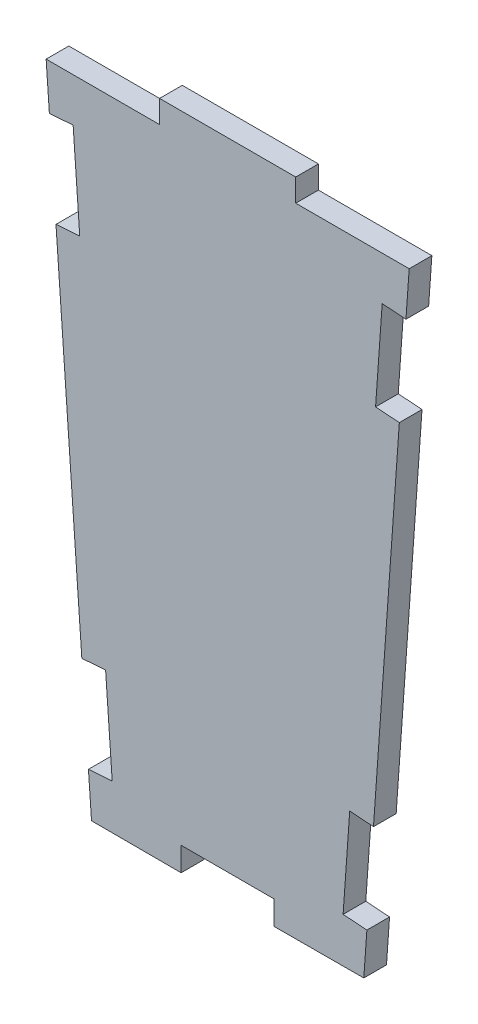
ISO-10303-21;
HEADER;
FILE_DESCRIPTION(('STEP AP214'),'2;1');
FILE_NAME('part.step','',(''),(''),'','','');
FILE_SCHEMA(('AUTOMOTIVE_DESIGN { 1 0 10303 214 1 1 1 1 }'));
ENDSEC;
DATA;
#1=APPLICATION_CONTEXT('core data for automotive mechanical design processes');
#2=APPLICATION_PROTOCOL_DEFINITION('international standard','automotive_design',2000,#1);
#3=PRODUCT_CONTEXT('',#1,'mechanical');
#4=PRODUCT('Part','Part','',(#3));
#5=PRODUCT_RELATED_PRODUCT_CATEGORY('part','',(#4));
#6=PRODUCT_DEFINITION_FORMATION('','',#4);
#7=PRODUCT_DEFINITION_CONTEXT('part definition',#1,'design');
#8=PRODUCT_DEFINITION('design','',#6,#7);
#9=PRODUCT_DEFINITION_SHAPE('','',#8);
#10=(LENGTH_UNIT() NAMED_UNIT(*) SI_UNIT(.MILLI.,.METRE.));
#11=(NAMED_UNIT(*) PLANE_ANGLE_UNIT() SI_UNIT($,.RADIAN.));
#12=(NAMED_UNIT(*) SI_UNIT($,.STERADIAN.) SOLID_ANGLE_UNIT());
#13=UNCERTAINTY_MEASURE_WITH_UNIT(LENGTH_MEASURE(1.E-05),#10,'distance_accuracy_value','');
#14=(GEOMETRIC_REPRESENTATION_CONTEXT(3) GLOBAL_UNCERTAINTY_ASSIGNED_CONTEXT((#13)) GLOBAL_UNIT_ASSIGNED_CONTEXT((#10,
#11,#12)) REPRESENTATION_CONTEXT('',''));
#15=CARTESIAN_POINT('',(0.,0.,0.));
#16=DIRECTION('',(0.,0.,1.));
#17=DIRECTION('',(1.,0.,0.));
#18=AXIS2_PLACEMENT_3D('',#15,#16,#17);
#19=CARTESIAN_POINT('',(363.747024457994,-153.683245156876,2.5));
#20=DIRECTION('',(0.0023210919259634,0.999997306262508,0.));
#21=DIRECTION('',(-0.999997306262508,0.0023210919259634,0.));
#22=AXIS2_PLACEMENT_3D('',#19,#20,#21);
#23=PLANE('',#22);
#24=DIRECTION('',(0.999997306262508,-0.0023210919259634,0.));
#25=VECTOR('',#24,1.);
#26=CARTESIAN_POINT('',(363.747024457994,-153.683245156876,-2.5));
#27=LINE('',#26,#25);
#28=CARTESIAN_POINT('',(363.747024457994,-153.683245156876,-2.5));
#29=VERTEX_POINT('',#28);
#30=CARTESIAN_POINT('',(383.496918055507,-153.729086598929,-2.5));
#31=VERTEX_POINT('',#30);
#32=EDGE_CURVE('E249',#29,#31,#27,.T.);
#33=ORIENTED_EDGE('',*,*,#32,.T.);
#34=DIRECTION('',(0.,0.,-1.));
#35=VECTOR('',#34,1.);
#36=CARTESIAN_POINT('',(383.496918055507,-153.729086598929,2.5));
#37=LINE('',#36,#35);
#38=CARTESIAN_POINT('',(383.496918055507,-153.729086598929,2.5));
#39=VERTEX_POINT('',#38);
#40=EDGE_CURVE('E11',#39,#31,#37,.T.);
#41=ORIENTED_EDGE('',*,*,#40,.F.);
#42=DIRECTION('',(0.999997306262508,-0.0023210919259634,0.));
#43=VECTOR('',#42,1.);
#44=CARTESIAN_POINT('',(363.747024457994,-153.683245156876,2.5));
#45=LINE('',#44,#43);
#46=CARTESIAN_POINT('',(363.747024457994,-153.683245156876,2.5));
#47=VERTEX_POINT('',#46);
#48=EDGE_CURVE('E303',#47,#39,#45,.T.);
#49=ORIENTED_EDGE('',*,*,#48,.F.);
#50=DIRECTION('',(0.,0.,-1.));
#51=VECTOR('',#50,1.);
#52=CARTESIAN_POINT('',(363.747024457994,-153.683245156876,2.5));
#53=LINE('',#52,#51);
#54=EDGE_CURVE('E245',#47,#29,#53,.T.);
#55=ORIENTED_EDGE('',*,*,#54,.T.);
#56=EDGE_LOOP('',(#33,#41,#49,#55));
#57=FACE_BOUND('',#56,.T.);
#58=ADVANCED_FACE('F33',(#57),#23,.F.);
#59=CARTESIAN_POINT('',(383.496918055507,-153.729086598929,2.5));
#60=DIRECTION('',(-0.999999999794576,2.02693821584738E-05,0.));
#61=DIRECTION('',(-2.02693821584738E-05,-0.999999999794576,0.));
#62=AXIS2_PLACEMENT_3D('',#59,#60,#61);
#63=PLANE('',#62);
#64=DIRECTION('',(2.02693821584738E-05,0.999999999794576,0.));
#65=VECTOR('',#64,1.);
#66=CARTESIAN_POINT('',(383.496918055507,-153.729086598929,-2.5));
#67=LINE('',#66,#65);
#68=CARTESIAN_POINT('',(383.497024457996,-148.479667120444,-2.5));
#69=VERTEX_POINT('',#68);
#70=EDGE_CURVE('E252',#31,#69,#67,.T.);
#71=ORIENTED_EDGE('',*,*,#70,.T.);
#72=DIRECTION('',(0.,0.,-1.));
#73=VECTOR('',#72,1.);
#74=CARTESIAN_POINT('',(383.497024457996,-148.479667120444,2.5));
#75=LINE('',#74,#73);
#76=CARTESIAN_POINT('',(383.497024457996,-148.479667120444,2.5));
#77=VERTEX_POINT('',#76);
#78=EDGE_CURVE('E41',#77,#69,#75,.T.);
#79=ORIENTED_EDGE('',*,*,#78,.F.);
#80=DIRECTION('',(2.02693821584738E-05,0.999999999794576,0.));
#81=VECTOR('',#80,1.);
#82=CARTESIAN_POINT('',(383.496918055507,-153.729086598929,2.5));
#83=LINE('',#82,#81);
#84=EDGE_CURVE('E152',#39,#77,#83,.T.);
#85=ORIENTED_EDGE('',*,*,#84,.F.);
#86=ORIENTED_EDGE('',*,*,#40,.T.);
#87=EDGE_LOOP('',(#71,#79,#85,#86));
#88=FACE_BOUND('',#87,.T.);
#89=ADVANCED_FACE('F461',(#88),#63,.F.);
#90=CARTESIAN_POINT('',(383.497024457996,-148.479667120444,2.5));
#91=DIRECTION('',(0.,1.,0.));
#92=DIRECTION('',(0.,0.,1.));
#93=AXIS2_PLACEMENT_3D('',#90,#91,#92);
#94=PLANE('',#93);
#95=DIRECTION('',(1.,0.,0.));
#96=VECTOR('',#95,1.);
#97=CARTESIAN_POINT('',(383.497024457996,-148.479667120444,-2.5));
#98=LINE('',#97,#96);
#99=CARTESIAN_POINT('',(403.996445189324,-148.479667120444,-2.5));
#100=VERTEX_POINT('',#99);
#101=EDGE_CURVE('E254',#69,#100,#98,.T.);
#102=ORIENTED_EDGE('',*,*,#101,.T.);
#103=DIRECTION('',(0.,0.,-1.));
#104=VECTOR('',#103,1.);
#105=CARTESIAN_POINT('',(403.996445189324,-148.479667120444,2.5));
#106=LINE('',#105,#104);
#107=CARTESIAN_POINT('',(403.996445189324,-148.479667120444,2.5));
#108=VERTEX_POINT('',#107);
#109=EDGE_CURVE('E370',#108,#100,#106,.T.);
#110=ORIENTED_EDGE('',*,*,#109,.F.);
#111=DIRECTION('',(1.,0.,0.));
#112=VECTOR('',#111,1.);
#113=CARTESIAN_POINT('',(383.497024457996,-148.479667120444,2.5));
#114=LINE('',#113,#112);
#115=EDGE_CURVE('E378',#77,#108,#114,.T.);
#116=ORIENTED_EDGE('',*,*,#115,.F.);
#117=ORIENTED_EDGE('',*,*,#78,.T.);
#118=EDGE_LOOP('',(#102,#110,#116,#117));
#119=FACE_BOUND('',#118,.T.);
#120=ADVANCED_FACE('F376',(#119),#94,.F.);
#121=CARTESIAN_POINT('',(403.996445189324,-148.479667120444,2.5));
#122=DIRECTION('',(0.999999991469407,0.000130618472053474,0.));
#123=DIRECTION('',(-0.000130618472053474,0.999999991469407,0.));
#124=AXIS2_PLACEMENT_3D('',#121,#122,#123);
#125=PLANE('',#124);
#126=DIRECTION('',(0.000130618472053474,-0.999999991469407,0.));
#127=VECTOR('',#126,1.);
#128=CARTESIAN_POINT('',(403.996445189324,-148.479667120444,-2.5));
#129=LINE('',#128,#127);
#130=CARTESIAN_POINT('',(403.997130860481,-153.729086598929,-2.5));
#131=VERTEX_POINT('',#130);
#132=EDGE_CURVE('E256',#100,#131,#129,.T.);
#133=ORIENTED_EDGE('',*,*,#132,.T.);
#134=DIRECTION('',(0.,0.,-1.));
#135=VECTOR('',#134,1.);
#136=CARTESIAN_POINT('',(403.997130860481,-153.729086598929,2.5));
#137=LINE('',#136,#135);
#138=CARTESIAN_POINT('',(403.997130860481,-153.729086598929,2.5));
#139=VERTEX_POINT('',#138);
#140=EDGE_CURVE('E367',#139,#131,#137,.T.);
#141=ORIENTED_EDGE('',*,*,#140,.F.);
#142=DIRECTION('',(0.000130618472053474,-0.999999991469407,0.));
#143=VECTOR('',#142,1.);
#144=CARTESIAN_POINT('',(403.996445189324,-148.479667120444,2.5));
#145=LINE('',#144,#143);
#146=EDGE_CURVE('E396',#108,#139,#145,.T.);
#147=ORIENTED_EDGE('',*,*,#146,.F.);
#148=ORIENTED_EDGE('',*,*,#109,.T.);
#149=EDGE_LOOP('',(#133,#141,#147,#148));
#150=FACE_BOUND('',#149,.T.);
#151=ADVANCED_FACE('F387',(#150),#125,.F.);
#152=CARTESIAN_POINT('',(423.747024457994,-153.683245156876,2.5));
#153=DIRECTION('',(-0.0023210919259634,0.999997306262508,0.));
#154=DIRECTION('',(-0.999997306262508,-0.0023210919259634,0.));
#155=AXIS2_PLACEMENT_3D('',#152,#153,#154);
#156=PLANE('',#155);
#157=DIRECTION('',(0.999997306262508,0.0023210919259634,0.));
#158=VECTOR('',#157,1.);
#159=CARTESIAN_POINT('',(423.747024457994,-153.683245156876,-2.5));
#160=LINE('',#159,#158);
#161=CARTESIAN_POINT('',(423.747024457994,-153.683245156876,-2.5));
#162=VERTEX_POINT('',#161);
#163=EDGE_CURVE('E258',#131,#162,#160,.T.);
#164=ORIENTED_EDGE('',*,*,#163,.T.);
#165=DIRECTION('',(0.,0.,-1.));
#166=VECTOR('',#165,1.);
#167=CARTESIAN_POINT('',(423.747024457994,-153.683245156876,2.5));
#168=LINE('',#167,#166);
#169=CARTESIAN_POINT('',(423.747024457994,-153.683245156876,2.5));
#170=VERTEX_POINT('',#169);
#171=EDGE_CURVE('E364',#170,#162,#168,.T.);
#172=ORIENTED_EDGE('',*,*,#171,.F.);
#173=DIRECTION('',(0.999997306262508,0.0023210919259634,0.));
#174=VECTOR('',#173,1.);
#175=CARTESIAN_POINT('',(423.747024457994,-153.683245156876,2.5));
#176=LINE('',#175,#174);
#177=EDGE_CURVE('E393',#139,#170,#176,.T.);
#178=ORIENTED_EDGE('',*,*,#177,.F.);
#179=ORIENTED_EDGE('',*,*,#140,.T.);
#180=EDGE_LOOP('',(#164,#172,#178,#179));
#181=FACE_BOUND('',#180,.T.);
#182=ADVANCED_FACE('F391',(#181),#156,.F.);
#183=CARTESIAN_POINT('',(424.423262183472,-144.191572442052,2.5));
#184=DIRECTION('',(-0.997471669801728,0.0710652372327852,0.));
#185=DIRECTION('',(-0.0710652372327852,-0.997471669801728,0.));
#186=AXIS2_PLACEMENT_3D('',#183,#184,#185);
#187=PLANE('',#186);
#188=DIRECTION('',(0.0710652372327852,0.997471669801728,0.));
#189=VECTOR('',#188,1.);
#190=CARTESIAN_POINT('',(424.423262183472,-144.191572442052,-2.5));
#191=LINE('',#190,#189);
#192=CARTESIAN_POINT('',(424.423262183472,-144.191572442052,-2.5));
#193=VERTEX_POINT('',#192);
#194=EDGE_CURVE('E260',#162,#193,#191,.T.);
#195=ORIENTED_EDGE('',*,*,#194,.T.);
#196=DIRECTION('',(0.,0.,-1.));
#197=VECTOR('',#196,1.);
#198=CARTESIAN_POINT('',(424.423262183472,-144.191572442052,2.5));
#199=LINE('',#198,#197);
#200=CARTESIAN_POINT('',(424.423262183472,-144.191572442052,2.5));
#201=VERTEX_POINT('',#200);
#202=EDGE_CURVE('E361',#201,#193,#199,.T.);
#203=ORIENTED_EDGE('',*,*,#202,.F.);
#204=DIRECTION('',(0.0710652372327852,0.997471669801728,0.));
#205=VECTOR('',#204,1.);
#206=CARTESIAN_POINT('',(424.423262183472,-144.191572442052,2.5));
#207=LINE('',#206,#205);
#208=EDGE_CURVE('E395',#170,#201,#207,.T.);
#209=ORIENTED_EDGE('',*,*,#208,.F.);
#210=ORIENTED_EDGE('',*,*,#171,.T.);
#211=EDGE_LOOP('',(#195,#203,#209,#210));
#212=FACE_BOUND('',#211,.T.);
#213=ADVANCED_FACE('F474',(#212),#187,.F.);
#214=CARTESIAN_POINT('',(419.186535917013,-143.818479946579,2.5));
#215=DIRECTION('',(-0.0710652372329773,-0.997471669801715,0.));
#216=DIRECTION('',(0.997471669801715,-0.0710652372329773,0.));
#217=AXIS2_PLACEMENT_3D('',#214,#215,#216);
#218=PLANE('',#217);
#219=DIRECTION('',(-0.997471669801715,0.0710652372329773,0.));
#220=VECTOR('',#219,1.);
#221=CARTESIAN_POINT('',(419.186535917013,-143.818479946579,-2.5));
#222=LINE('',#221,#220);
#223=CARTESIAN_POINT('',(419.186535917013,-143.818479946579,-2.5));
#224=VERTEX_POINT('',#223);
#225=EDGE_CURVE('E262',#193,#224,#222,.T.);
#226=ORIENTED_EDGE('',*,*,#225,.T.);
#227=DIRECTION('',(0.,0.,-1.));
#228=VECTOR('',#227,1.);
#229=CARTESIAN_POINT('',(419.186535917013,-143.818479946579,2.5));
#230=LINE('',#229,#228);
#231=CARTESIAN_POINT('',(419.186535917013,-143.818479946579,2.5));
#232=VERTEX_POINT('',#231);
#233=EDGE_CURVE('E358',#232,#224,#230,.T.);
#234=ORIENTED_EDGE('',*,*,#233,.F.);
#235=DIRECTION('',(-0.997471669801715,0.0710652372329773,0.));
#236=VECTOR('',#235,1.);
#237=CARTESIAN_POINT('',(419.186535917013,-143.818479946579,2.5));
#238=LINE('',#237,#236);
#239=EDGE_CURVE('E398',#201,#232,#238,.T.);
#240=ORIENTED_EDGE('',*,*,#239,.F.);
#241=ORIENTED_EDGE('',*,*,#202,.T.);
#242=EDGE_LOOP('',(#226,#234,#240,#241));
#243=FACE_BOUND('',#242,.T.);
#244=ADVANCED_FACE('F477',(#243),#218,.F.);
#245=CARTESIAN_POINT('',(420.64337328029,-123.370310715643,2.5));
#246=DIRECTION('',(-0.997471669801713,0.0710652372330059,0.));
#247=DIRECTION('',(-0.0710652372330059,-0.997471669801713,0.));
#248=AXIS2_PLACEMENT_3D('',#245,#246,#247);
#249=PLANE('',#248);
#250=DIRECTION('',(0.0710652372330059,0.997471669801713,0.));
#251=VECTOR('',#250,1.);
#252=CARTESIAN_POINT('',(420.64337328029,-123.370310715643,-2.5));
#253=LINE('',#252,#251);
#254=CARTESIAN_POINT('',(420.64337328029,-123.370310715643,-2.5));
#255=VERTEX_POINT('',#254);
#256=EDGE_CURVE('E264',#224,#255,#253,.T.);
#257=ORIENTED_EDGE('',*,*,#256,.T.);
#258=DIRECTION('',(0.,0.,-1.));
#259=VECTOR('',#258,1.);
#260=CARTESIAN_POINT('',(420.64337328029,-123.370310715643,2.5));
#261=LINE('',#260,#259);
#262=CARTESIAN_POINT('',(420.64337328029,-123.370310715643,2.5));
#263=VERTEX_POINT('',#262);
#264=EDGE_CURVE('E355',#263,#255,#261,.T.);
#265=ORIENTED_EDGE('',*,*,#264,.F.);
#266=DIRECTION('',(0.0710652372330059,0.997471669801713,0.));
#267=VECTOR('',#266,1.);
#268=CARTESIAN_POINT('',(420.64337328029,-123.370310715643,2.5));
#269=LINE('',#268,#267);
#270=EDGE_CURVE('E404',#232,#263,#269,.T.);
#271=ORIENTED_EDGE('',*,*,#270,.F.);
#272=ORIENTED_EDGE('',*,*,#233,.T.);
#273=EDGE_LOOP('',(#257,#265,#271,#272));
#274=FACE_BOUND('',#273,.T.);
#275=ADVANCED_FACE('F481',(#274),#249,.F.);
#276=CARTESIAN_POINT('',(425.880099546749,-123.743403211116,2.5));
#277=DIRECTION('',(0.0710652372329108,0.997471669801719,0.));
#278=DIRECTION('',(-0.997471669801719,0.0710652372329108,0.));
#279=AXIS2_PLACEMENT_3D('',#276,#277,#278);
#280=PLANE('',#279);
#281=DIRECTION('',(0.997471669801719,-0.0710652372329108,0.));
#282=VECTOR('',#281,1.);
#283=CARTESIAN_POINT('',(425.880099546749,-123.743403211116,-2.5));
#284=LINE('',#283,#282);
#285=CARTESIAN_POINT('',(425.880099546749,-123.743403211116,-2.5));
#286=VERTEX_POINT('',#285);
#287=EDGE_CURVE('E266',#255,#286,#284,.T.);
#288=ORIENTED_EDGE('',*,*,#287,.T.);
#289=DIRECTION('',(0.,0.,-1.));
#290=VECTOR('',#289,1.);
#291=CARTESIAN_POINT('',(425.880099546749,-123.743403211116,2.5));
#292=LINE('',#291,#290);
#293=CARTESIAN_POINT('',(425.880099546749,-123.743403211116,2.5));
#294=VERTEX_POINT('',#293);
#295=EDGE_CURVE('E352',#294,#286,#292,.T.);
#296=ORIENTED_EDGE('',*,*,#295,.F.);
#297=DIRECTION('',(0.997471669801719,-0.0710652372329108,0.));
#298=VECTOR('',#297,1.);
#299=CARTESIAN_POINT('',(425.880099546749,-123.743403211116,2.5));
#300=LINE('',#299,#298);
#301=EDGE_CURVE('E406',#263,#294,#300,.T.);
#302=ORIENTED_EDGE('',*,*,#301,.F.);
#303=ORIENTED_EDGE('',*,*,#264,.T.);
#304=EDGE_LOOP('',(#288,#296,#302,#303));
#305=FACE_BOUND('',#304,.T.);
#306=ADVANCED_FACE('F485',(#305),#280,.F.);
#307=CARTESIAN_POINT('',(431.577507118818,-43.7745905295464,2.5));
#308=DIRECTION('',(-0.997471669801717,0.0710652372329441,0.));
#309=DIRECTION('',(-0.0710652372329441,-0.997471669801717,0.));
#310=AXIS2_PLACEMENT_3D('',#307,#308,#309);
#311=PLANE('',#310);
#312=DIRECTION('',(0.0710652372329441,0.997471669801717,0.));
#313=VECTOR('',#312,1.);
#314=CARTESIAN_POINT('',(431.577507118818,-43.7745905295464,-2.5));
#315=LINE('',#314,#313);
#316=CARTESIAN_POINT('',(431.577507118818,-43.7745905295464,-2.5));
#317=VERTEX_POINT('',#316);
#318=EDGE_CURVE('E268',#286,#317,#315,.T.);
#319=ORIENTED_EDGE('',*,*,#318,.T.);
#320=DIRECTION('',(0.,0.,-1.));
#321=VECTOR('',#320,1.);
#322=CARTESIAN_POINT('',(431.577507118818,-43.7745905295464,2.5));
#323=LINE('',#322,#321);
#324=CARTESIAN_POINT('',(431.577507118818,-43.7745905295464,2.5));
#325=VERTEX_POINT('',#324);
#326=EDGE_CURVE('E349',#325,#317,#323,.T.);
#327=ORIENTED_EDGE('',*,*,#326,.F.);
#328=DIRECTION('',(0.0710652372329441,0.997471669801717,0.));
#329=VECTOR('',#328,1.);
#330=CARTESIAN_POINT('',(431.577507118818,-43.7745905295464,2.5));
#331=LINE('',#330,#329);
#332=EDGE_CURVE('E408',#294,#325,#331,.T.);
#333=ORIENTED_EDGE('',*,*,#332,.F.);
#334=ORIENTED_EDGE('',*,*,#295,.T.);
#335=EDGE_LOOP('',(#319,#327,#333,#334));
#336=FACE_BOUND('',#335,.T.);
#337=ADVANCED_FACE('F489',(#336),#311,.F.);
#338=CARTESIAN_POINT('',(426.340780852359,-43.4014980340735,2.5));
#339=DIRECTION('',(-0.0710652372329437,-0.997471669801717,0.));
#340=DIRECTION('',(0.997471669801717,-0.0710652372329437,0.));
#341=AXIS2_PLACEMENT_3D('',#338,#339,#340);
#342=PLANE('',#341);
#343=DIRECTION('',(-0.997471669801717,0.0710652372329437,0.));
#344=VECTOR('',#343,1.);
#345=CARTESIAN_POINT('',(426.340780852359,-43.4014980340735,-2.5));
#346=LINE('',#345,#344);
#347=CARTESIAN_POINT('',(426.340780852359,-43.4014980340735,-2.5));
#348=VERTEX_POINT('',#347);
#349=EDGE_CURVE('E270',#317,#348,#346,.T.);
#350=ORIENTED_EDGE('',*,*,#349,.T.);
#351=DIRECTION('',(0.,0.,-1.));
#352=VECTOR('',#351,1.);
#353=CARTESIAN_POINT('',(426.340780852359,-43.4014980340735,2.5));
#354=LINE('',#353,#352);
#355=CARTESIAN_POINT('',(426.340780852359,-43.4014980340735,2.5));
#356=VERTEX_POINT('',#355);
#357=EDGE_CURVE('E346',#356,#348,#354,.T.);
#358=ORIENTED_EDGE('',*,*,#357,.F.);
#359=DIRECTION('',(-0.997471669801717,0.0710652372329437,0.));
#360=VECTOR('',#359,1.);
#361=CARTESIAN_POINT('',(426.340780852359,-43.4014980340735,2.5));
#362=LINE('',#361,#360);
#363=EDGE_CURVE('E410',#325,#356,#362,.T.);
#364=ORIENTED_EDGE('',*,*,#363,.F.);
#365=ORIENTED_EDGE('',*,*,#326,.T.);
#366=EDGE_LOOP('',(#350,#358,#364,#365));
#367=FACE_BOUND('',#366,.T.);
#368=ADVANCED_FACE('F493',(#367),#342,.F.);
#369=CARTESIAN_POINT('',(427.797618215636,-22.9533288031375,2.5));
#370=DIRECTION('',(-0.997471669801713,0.0710652372330053,0.));
#371=DIRECTION('',(-0.0710652372330053,-0.997471669801713,0.));
#372=AXIS2_PLACEMENT_3D('',#369,#370,#371);
#373=PLANE('',#372);
#374=DIRECTION('',(0.0710652372330053,0.997471669801713,0.));
#375=VECTOR('',#374,1.);
#376=CARTESIAN_POINT('',(427.797618215636,-22.9533288031375,-2.5));
#377=LINE('',#376,#375);
#378=CARTESIAN_POINT('',(427.797618215636,-22.9533288031375,-2.5));
#379=VERTEX_POINT('',#378);
#380=EDGE_CURVE('E272',#348,#379,#377,.T.);
#381=ORIENTED_EDGE('',*,*,#380,.T.);
#382=DIRECTION('',(0.,0.,-1.));
#383=VECTOR('',#382,1.);
#384=CARTESIAN_POINT('',(427.797618215636,-22.9533288031375,2.5));
#385=LINE('',#384,#383);
#386=CARTESIAN_POINT('',(427.797618215636,-22.9533288031375,2.5));
#387=VERTEX_POINT('',#386);
#388=EDGE_CURVE('E343',#387,#379,#385,.T.);
#389=ORIENTED_EDGE('',*,*,#388,.F.);
#390=DIRECTION('',(0.0710652372330053,0.997471669801713,0.));
#391=VECTOR('',#390,1.);
#392=CARTESIAN_POINT('',(427.797618215636,-22.9533288031375,2.5));
#393=LINE('',#392,#391);
#394=EDGE_CURVE('E412',#356,#387,#393,.T.);
#395=ORIENTED_EDGE('',*,*,#394,.F.);
#396=ORIENTED_EDGE('',*,*,#357,.T.);
#397=EDGE_LOOP('',(#381,#389,#395,#396));
#398=FACE_BOUND('',#397,.T.);
#399=ADVANCED_FACE('F497',(#398),#373,.F.);
#400=CARTESIAN_POINT('',(433.034344482094,-23.3264212986106,2.5));
#401=DIRECTION('',(0.0710652372329765,0.997471669801715,0.));
#402=DIRECTION('',(-0.997471669801715,0.0710652372329765,0.));
#403=AXIS2_PLACEMENT_3D('',#400,#401,#402);
#404=PLANE('',#403);
#405=DIRECTION('',(0.997471669801715,-0.0710652372329765,0.));
#406=VECTOR('',#405,1.);
#407=CARTESIAN_POINT('',(433.034344482094,-23.3264212986106,-2.5));
#408=LINE('',#407,#406);
#409=CARTESIAN_POINT('',(433.034344482094,-23.3264212986106,-2.5));
#410=VERTEX_POINT('',#409);
#411=EDGE_CURVE('E274',#379,#410,#408,.T.);
#412=ORIENTED_EDGE('',*,*,#411,.T.);
#413=DIRECTION('',(0.,0.,-1.));
#414=VECTOR('',#413,1.);
#415=CARTESIAN_POINT('',(433.034344482094,-23.3264212986106,2.5));
#416=LINE('',#415,#414);
#417=CARTESIAN_POINT('',(433.034344482094,-23.3264212986106,2.5));
#418=VERTEX_POINT('',#417);
#419=EDGE_CURVE('E340',#418,#410,#416,.T.);
#420=ORIENTED_EDGE('',*,*,#419,.F.);
#421=DIRECTION('',(0.997471669801715,-0.0710652372329765,0.));
#422=VECTOR('',#421,1.);
#423=CARTESIAN_POINT('',(433.034344482094,-23.3264212986106,2.5));
#424=LINE('',#423,#422);
#425=EDGE_CURVE('E414',#387,#418,#424,.T.);
#426=ORIENTED_EDGE('',*,*,#425,.F.);
#427=ORIENTED_EDGE('',*,*,#388,.T.);
#428=EDGE_LOOP('',(#412,#420,#426,#427));
#429=FACE_BOUND('',#428,.T.);
#430=ADVANCED_FACE('F501',(#429),#404,.F.);
#431=CARTESIAN_POINT('',(433.747024457995,-13.3232451568764,2.5));
#432=DIRECTION('',(-0.997471669801713,0.0710652372330026,0.));
#433=DIRECTION('',(-0.0710652372330026,-0.997471669801713,0.));
#434=AXIS2_PLACEMENT_3D('',#431,#432,#433);
#435=PLANE('',#434);
#436=DIRECTION('',(0.0710652372330026,0.997471669801713,0.));
#437=VECTOR('',#436,1.);
#438=CARTESIAN_POINT('',(433.747024457995,-13.3232451568764,-2.5));
#439=LINE('',#438,#437);
#440=CARTESIAN_POINT('',(433.747024457995,-13.3232451568764,-2.5));
#441=VERTEX_POINT('',#440);
#442=EDGE_CURVE('E276',#410,#441,#439,.T.);
#443=ORIENTED_EDGE('',*,*,#442,.T.);
#444=DIRECTION('',(0.,0.,-1.));
#445=VECTOR('',#444,1.);
#446=CARTESIAN_POINT('',(433.747024457995,-13.3232451568764,2.5));
#447=LINE('',#446,#445);
#448=CARTESIAN_POINT('',(433.747024457995,-13.3232451568764,2.5));
#449=VERTEX_POINT('',#448);
#450=EDGE_CURVE('E337',#449,#441,#447,.T.);
#451=ORIENTED_EDGE('',*,*,#450,.F.);
#452=DIRECTION('',(0.0710652372330026,0.997471669801713,0.));
#453=VECTOR('',#452,1.);
#454=CARTESIAN_POINT('',(433.747024457995,-13.3232451568764,2.5));
#455=LINE('',#454,#453);
#456=EDGE_CURVE('E416',#418,#449,#455,.T.);
#457=ORIENTED_EDGE('',*,*,#456,.F.);
#458=ORIENTED_EDGE('',*,*,#419,.T.);
#459=EDGE_LOOP('',(#443,#451,#457,#458));
#460=FACE_BOUND('',#459,.T.);
#461=ADVANCED_FACE('F505',(#460),#435,.F.);
#462=CARTESIAN_POINT('',(408.747024457995,-13.3232451568764,2.5));
#463=DIRECTION('',(0.,-1.,0.));
#464=DIRECTION('',(0.,0.,-1.));
#465=AXIS2_PLACEMENT_3D('',#462,#463,#464);
#466=PLANE('',#465);
#467=DIRECTION('',(-1.,0.,0.));
#468=VECTOR('',#467,1.);
#469=CARTESIAN_POINT('',(408.747024457995,-13.3232451568764,-2.5));
#470=LINE('',#469,#468);
#471=CARTESIAN_POINT('',(408.747024457995,-13.3232451568764,-2.5));
#472=VERTEX_POINT('',#471);
#473=EDGE_CURVE('E278',#441,#472,#470,.T.);
#474=ORIENTED_EDGE('',*,*,#473,.T.);
#475=DIRECTION('',(0.,0.,-1.));
#476=VECTOR('',#475,1.);
#477=CARTESIAN_POINT('',(408.747024457995,-13.3232451568764,2.5));
#478=LINE('',#477,#476);
#479=CARTESIAN_POINT('',(408.747024457995,-13.3232451568764,2.5));
#480=VERTEX_POINT('',#479);
#481=EDGE_CURVE('E334',#480,#472,#478,.T.);
#482=ORIENTED_EDGE('',*,*,#481,.F.);
#483=DIRECTION('',(-1.,0.,0.));
#484=VECTOR('',#483,1.);
#485=CARTESIAN_POINT('',(408.747024457995,-13.3232451568764,2.5));
#486=LINE('',#485,#484);
#487=EDGE_CURVE('E418',#449,#480,#486,.T.);
#488=ORIENTED_EDGE('',*,*,#487,.F.);
#489=ORIENTED_EDGE('',*,*,#450,.T.);
#490=EDGE_LOOP('',(#474,#482,#488,#489));
#491=FACE_BOUND('',#490,.T.);
#492=ADVANCED_FACE('F509',(#491),#466,.F.);
#493=CARTESIAN_POINT('',(408.747024457995,-8.32324515687648,2.5));
#494=DIRECTION('',(-1.,0.,0.));
#495=DIRECTION('',(0.,0.,1.));
#496=AXIS2_PLACEMENT_3D('',#493,#494,#495);
#497=PLANE('',#496);
#498=DIRECTION('',(0.,1.,0.));
#499=VECTOR('',#498,1.);
#500=CARTESIAN_POINT('',(408.747024457995,-8.32324515687648,-2.5));
#501=LINE('',#500,#499);
#502=CARTESIAN_POINT('',(408.747024457995,-8.32324515687648,-2.5));
#503=VERTEX_POINT('',#502);
#504=EDGE_CURVE('E280',#472,#503,#501,.T.);
#505=ORIENTED_EDGE('',*,*,#504,.T.);
#506=DIRECTION('',(0.,0.,-1.));
#507=VECTOR('',#506,1.);
#508=CARTESIAN_POINT('',(408.747024457995,-8.32324515687648,2.5));
#509=LINE('',#508,#507);
#510=CARTESIAN_POINT('',(408.747024457995,-8.32324515687648,2.5));
#511=VERTEX_POINT('',#510);
#512=EDGE_CURVE('E331',#511,#503,#509,.T.);
#513=ORIENTED_EDGE('',*,*,#512,.F.);
#514=DIRECTION('',(0.,1.,0.));
#515=VECTOR('',#514,1.);
#516=CARTESIAN_POINT('',(408.747024457995,-8.32324515687648,2.5));
#517=LINE('',#516,#515);
#518=EDGE_CURVE('E420',#480,#511,#517,.T.);
#519=ORIENTED_EDGE('',*,*,#518,.F.);
#520=ORIENTED_EDGE('',*,*,#481,.T.);
#521=EDGE_LOOP('',(#505,#513,#519,#520));
#522=FACE_BOUND('',#521,.T.);
#523=ADVANCED_FACE('F513',(#522),#497,.F.);
#524=CARTESIAN_POINT('',(378.747024457993,-8.32324515687648,2.5));
#525=DIRECTION('',(0.,-1.,0.));
#526=DIRECTION('',(0.,0.,-1.));
#527=AXIS2_PLACEMENT_3D('',#524,#525,#526);
#528=PLANE('',#527);
#529=DIRECTION('',(-1.,0.,0.));
#530=VECTOR('',#529,1.);
#531=CARTESIAN_POINT('',(378.747024457993,-8.32324515687648,-2.5));
#532=LINE('',#531,#530);
#533=CARTESIAN_POINT('',(378.747024457993,-8.32324515687648,-2.5));
#534=VERTEX_POINT('',#533);
#535=EDGE_CURVE('E282',#503,#534,#532,.T.);
#536=ORIENTED_EDGE('',*,*,#535,.T.);
#537=DIRECTION('',(0.,0.,-1.));
#538=VECTOR('',#537,1.);
#539=CARTESIAN_POINT('',(378.747024457993,-8.32324515687648,2.5));
#540=LINE('',#539,#538);
#541=CARTESIAN_POINT('',(378.747024457993,-8.32324515687648,2.5));
#542=VERTEX_POINT('',#541);
#543=EDGE_CURVE('E328',#542,#534,#540,.T.);
#544=ORIENTED_EDGE('',*,*,#543,.F.);
#545=DIRECTION('',(-1.,0.,0.));
#546=VECTOR('',#545,1.);
#547=CARTESIAN_POINT('',(378.747024457993,-8.32324515687648,2.5));
#548=LINE('',#547,#546);
#549=EDGE_CURVE('E422',#511,#542,#548,.T.);
#550=ORIENTED_EDGE('',*,*,#549,.F.);
#551=ORIENTED_EDGE('',*,*,#512,.T.);
#552=EDGE_LOOP('',(#536,#544,#550,#551));
#553=FACE_BOUND('',#552,.T.);
#554=ADVANCED_FACE('F517',(#553),#528,.F.);
#555=CARTESIAN_POINT('',(378.747024457993,-8.32324515687648,2.5));
#556=DIRECTION('',(1.,0.,0.));
#557=DIRECTION('',(0.,0.,-1.));
#558=AXIS2_PLACEMENT_3D('',#555,#556,#557);
#559=PLANE('',#558);
#560=DIRECTION('',(0.,-1.,0.));
#561=VECTOR('',#560,1.);
#562=CARTESIAN_POINT('',(378.747024457993,-8.32324515687648,-2.5));
#563=LINE('',#562,#561);
#564=CARTESIAN_POINT('',(378.747024457993,-13.3232451568764,-2.5));
#565=VERTEX_POINT('',#564);
#566=EDGE_CURVE('E284',#534,#565,#563,.T.);
#567=ORIENTED_EDGE('',*,*,#566,.T.);
#568=DIRECTION('',(0.,0.,-1.));
#569=VECTOR('',#568,1.);
#570=CARTESIAN_POINT('',(378.747024457993,-13.3232451568764,2.5));
#571=LINE('',#570,#569);
#572=CARTESIAN_POINT('',(378.747024457993,-13.3232451568764,2.5));
#573=VERTEX_POINT('',#572);
#574=EDGE_CURVE('E325',#573,#565,#571,.T.);
#575=ORIENTED_EDGE('',*,*,#574,.F.);
#576=DIRECTION('',(0.,-1.,0.));
#577=VECTOR('',#576,1.);
#578=CARTESIAN_POINT('',(378.747024457993,-8.32324515687648,2.5));
#579=LINE('',#578,#577);
#580=EDGE_CURVE('E424',#542,#573,#579,.T.);
#581=ORIENTED_EDGE('',*,*,#580,.F.);
#582=ORIENTED_EDGE('',*,*,#543,.T.);
#583=EDGE_LOOP('',(#567,#575,#581,#582));
#584=FACE_BOUND('',#583,.T.);
#585=ADVANCED_FACE('F521',(#584),#559,.F.);
#586=CARTESIAN_POINT('',(378.747024457993,-13.3232451568764,2.5));
#587=DIRECTION('',(0.,-1.,0.));
#588=DIRECTION('',(0.,0.,-1.));
#589=AXIS2_PLACEMENT_3D('',#586,#587,#588);
#590=PLANE('',#589);
#591=DIRECTION('',(-1.,0.,0.));
#592=VECTOR('',#591,1.);
#593=CARTESIAN_POINT('',(378.747024457993,-13.3232451568764,-2.5));
#594=LINE('',#593,#592);
#595=CARTESIAN_POINT('',(353.747024457993,-13.3232451568764,-2.5));
#596=VERTEX_POINT('',#595);
#597=EDGE_CURVE('E286',#565,#596,#594,.T.);
#598=ORIENTED_EDGE('',*,*,#597,.T.);
#599=DIRECTION('',(0.,0.,-1.));
#600=VECTOR('',#599,1.);
#601=CARTESIAN_POINT('',(353.747024457993,-13.3232451568764,2.5));
#602=LINE('',#601,#600);
#603=CARTESIAN_POINT('',(353.747024457993,-13.3232451568764,2.5));
#604=VERTEX_POINT('',#603);
#605=EDGE_CURVE('E322',#604,#596,#602,.T.);
#606=ORIENTED_EDGE('',*,*,#605,.F.);
#607=DIRECTION('',(-1.,0.,0.));
#608=VECTOR('',#607,1.);
#609=CARTESIAN_POINT('',(378.747024457993,-13.3232451568764,2.5));
#610=LINE('',#609,#608);
#611=EDGE_CURVE('E426',#573,#604,#610,.T.);
#612=ORIENTED_EDGE('',*,*,#611,.F.);
#613=ORIENTED_EDGE('',*,*,#574,.T.);
#614=EDGE_LOOP('',(#598,#606,#612,#613));
#615=FACE_BOUND('',#614,.T.);
#616=ADVANCED_FACE('F525',(#615),#590,.F.);
#617=CARTESIAN_POINT('',(353.747024457993,-13.3232451568764,2.5));
#618=DIRECTION('',(0.997471669801712,0.0710652372330136,0.));
#619=DIRECTION('',(-0.0710652372330136,0.997471669801712,0.));
#620=AXIS2_PLACEMENT_3D('',#617,#618,#619);
#621=PLANE('',#620);
#622=DIRECTION('',(0.0710652372330136,-0.997471669801712,0.));
#623=VECTOR('',#622,1.);
#624=CARTESIAN_POINT('',(353.747024457993,-13.3232451568764,-2.5));
#625=LINE('',#624,#623);
#626=CARTESIAN_POINT('',(354.459704433894,-23.3264212986106,-2.5));
#627=VERTEX_POINT('',#626);
#628=EDGE_CURVE('E288',#596,#627,#625,.T.);
#629=ORIENTED_EDGE('',*,*,#628,.T.);
#630=DIRECTION('',(0.,0.,-1.));
#631=VECTOR('',#630,1.);
#632=CARTESIAN_POINT('',(354.459704433894,-23.3264212986106,2.5));
#633=LINE('',#632,#631);
#634=CARTESIAN_POINT('',(354.459704433894,-23.3264212986106,2.5));
#635=VERTEX_POINT('',#634);
#636=EDGE_CURVE('E319',#635,#627,#633,.T.);
#637=ORIENTED_EDGE('',*,*,#636,.F.);
#638=DIRECTION('',(0.0710652372330136,-0.997471669801712,0.));
#639=VECTOR('',#638,1.);
#640=CARTESIAN_POINT('',(353.747024457993,-13.3232451568764,2.5));
#641=LINE('',#640,#639);
#642=EDGE_CURVE('E428',#604,#635,#641,.T.);
#643=ORIENTED_EDGE('',*,*,#642,.F.);
#644=ORIENTED_EDGE('',*,*,#605,.T.);
#645=EDGE_LOOP('',(#629,#637,#643,#644));
#646=FACE_BOUND('',#645,.T.);
#647=ADVANCED_FACE('F529',(#646),#621,.F.);
#648=CARTESIAN_POINT('',(354.459704433894,-23.3264212986106,2.5));
#649=DIRECTION('',(-0.071065237232978,0.997471669801714,0.));
#650=DIRECTION('',(-0.997471669801715,-0.071065237232978,0.));
#651=AXIS2_PLACEMENT_3D('',#648,#649,#650);
#652=PLANE('',#651);
#653=DIRECTION('',(0.997471669801715,0.071065237232978,0.));
#654=VECTOR('',#653,1.);
#655=CARTESIAN_POINT('',(354.459704433894,-23.3264212986106,-2.5));
#656=LINE('',#655,#654);
#657=CARTESIAN_POINT('',(359.696430700352,-22.9533288031375,-2.5));
#658=VERTEX_POINT('',#657);
#659=EDGE_CURVE('E290',#627,#658,#656,.T.);
#660=ORIENTED_EDGE('',*,*,#659,.T.);
#661=DIRECTION('',(0.,0.,-1.));
#662=VECTOR('',#661,1.);
#663=CARTESIAN_POINT('',(359.696430700352,-22.9533288031375,2.5));
#664=LINE('',#663,#662);
#665=CARTESIAN_POINT('',(359.696430700352,-22.9533288031375,2.5));
#666=VERTEX_POINT('',#665);
#667=EDGE_CURVE('E316',#666,#658,#664,.T.);
#668=ORIENTED_EDGE('',*,*,#667,.F.);
#669=DIRECTION('',(0.997471669801715,0.071065237232978,0.));
#670=VECTOR('',#669,1.);
#671=CARTESIAN_POINT('',(354.459704433894,-23.3264212986106,2.5));
#672=LINE('',#671,#670);
#673=EDGE_CURVE('E430',#635,#666,#672,.T.);
#674=ORIENTED_EDGE('',*,*,#673,.F.);
#675=ORIENTED_EDGE('',*,*,#636,.T.);
#676=EDGE_LOOP('',(#660,#668,#674,#675));
#677=FACE_BOUND('',#676,.T.);
#678=ADVANCED_FACE('F533',(#677),#652,.F.);
#679=CARTESIAN_POINT('',(359.696430700352,-22.9533288031375,2.5));
#680=DIRECTION('',(0.997471669801713,0.0710652372330053,0.));
#681=DIRECTION('',(-0.0710652372330053,0.997471669801713,0.));
#682=AXIS2_PLACEMENT_3D('',#679,#680,#681);
#683=PLANE('',#682);
#684=DIRECTION('',(0.0710652372330053,-0.997471669801713,0.));
#685=VECTOR('',#684,1.);
#686=CARTESIAN_POINT('',(359.696430700352,-22.9533288031375,-2.5));
#687=LINE('',#686,#685);
#688=CARTESIAN_POINT('',(361.153268063629,-43.4014980340735,-2.5));
#689=VERTEX_POINT('',#688);
#690=EDGE_CURVE('E292',#658,#689,#687,.T.);
#691=ORIENTED_EDGE('',*,*,#690,.T.);
#692=DIRECTION('',(0.,0.,-1.));
#693=VECTOR('',#692,1.);
#694=CARTESIAN_POINT('',(361.153268063629,-43.4014980340735,2.5));
#695=LINE('',#694,#693);
#696=CARTESIAN_POINT('',(361.153268063629,-43.4014980340735,2.5));
#697=VERTEX_POINT('',#696);
#698=EDGE_CURVE('E313',#697,#689,#695,.T.);
#699=ORIENTED_EDGE('',*,*,#698,.F.);
#700=DIRECTION('',(0.0710652372330053,-0.997471669801713,0.));
#701=VECTOR('',#700,1.);
#702=CARTESIAN_POINT('',(359.696430700352,-22.9533288031375,2.5));
#703=LINE('',#702,#701);
#704=EDGE_CURVE('E432',#666,#697,#703,.T.);
#705=ORIENTED_EDGE('',*,*,#704,.F.);
#706=ORIENTED_EDGE('',*,*,#667,.T.);
#707=EDGE_LOOP('',(#691,#699,#705,#706));
#708=FACE_BOUND('',#707,.T.);
#709=ADVANCED_FACE('F537',(#708),#683,.F.);
#710=CARTESIAN_POINT('',(361.153268063629,-43.4014980340735,2.5));
#711=DIRECTION('',(0.0710652372329445,-0.997471669801717,0.));
#712=DIRECTION('',(0.997471669801717,0.0710652372329445,0.));
#713=AXIS2_PLACEMENT_3D('',#710,#711,#712);
#714=PLANE('',#713);
#715=DIRECTION('',(-0.997471669801717,-0.0710652372329444,0.));
#716=VECTOR('',#715,1.);
#717=CARTESIAN_POINT('',(361.153268063629,-43.4014980340735,-2.5));
#718=LINE('',#717,#716);
#719=CARTESIAN_POINT('',(355.91654179717,-43.7745905295464,-2.5));
#720=VERTEX_POINT('',#719);
#721=EDGE_CURVE('E294',#689,#720,#718,.T.);
#722=ORIENTED_EDGE('',*,*,#721,.T.);
#723=DIRECTION('',(0.,0.,-1.));
#724=VECTOR('',#723,1.);
#725=CARTESIAN_POINT('',(355.91654179717,-43.7745905295464,2.5));
#726=LINE('',#725,#724);
#727=CARTESIAN_POINT('',(355.91654179717,-43.7745905295464,2.5));
#728=VERTEX_POINT('',#727);
#729=EDGE_CURVE('E310',#728,#720,#726,.T.);
#730=ORIENTED_EDGE('',*,*,#729,.F.);
#731=DIRECTION('',(-0.997471669801717,-0.0710652372329444,0.));
#732=VECTOR('',#731,1.);
#733=CARTESIAN_POINT('',(361.153268063629,-43.4014980340735,2.5));
#734=LINE('',#733,#732);
#735=EDGE_CURVE('E434',#697,#728,#734,.T.);
#736=ORIENTED_EDGE('',*,*,#735,.F.);
#737=ORIENTED_EDGE('',*,*,#698,.T.);
#738=EDGE_LOOP('',(#722,#730,#736,#737));
#739=FACE_BOUND('',#738,.T.);
#740=ADVANCED_FACE('F541',(#739),#714,.F.);
#741=CARTESIAN_POINT('',(355.91654179717,-43.7745905295464,2.5));
#742=DIRECTION('',(0.997471669801717,0.0710652372329441,0.));
#743=DIRECTION('',(-0.0710652372329441,0.997471669801717,0.));
#744=AXIS2_PLACEMENT_3D('',#741,#742,#743);
#745=PLANE('',#744);
#746=DIRECTION('',(0.0710652372329441,-0.997471669801717,0.));
#747=VECTOR('',#746,1.);
#748=CARTESIAN_POINT('',(355.91654179717,-43.7745905295464,-2.5));
#749=LINE('',#748,#747);
#750=CARTESIAN_POINT('',(361.613949369239,-123.743403211116,-2.5));
#751=VERTEX_POINT('',#750);
#752=EDGE_CURVE('E296',#720,#751,#749,.T.);
#753=ORIENTED_EDGE('',*,*,#752,.T.);
#754=DIRECTION('',(0.,0.,-1.));
#755=VECTOR('',#754,1.);
#756=CARTESIAN_POINT('',(361.613949369239,-123.743403211116,2.5));
#757=LINE('',#756,#755);
#758=CARTESIAN_POINT('',(361.613949369239,-123.743403211116,2.5));
#759=VERTEX_POINT('',#758);
#760=EDGE_CURVE('E307',#759,#751,#757,.T.);
#761=ORIENTED_EDGE('',*,*,#760,.F.);
#762=DIRECTION('',(0.0710652372329441,-0.997471669801717,0.));
#763=VECTOR('',#762,1.);
#764=CARTESIAN_POINT('',(355.91654179717,-43.7745905295464,2.5));
#765=LINE('',#764,#763);
#766=EDGE_CURVE('E436',#728,#759,#765,.T.);
#767=ORIENTED_EDGE('',*,*,#766,.F.);
#768=ORIENTED_EDGE('',*,*,#729,.T.);
#769=EDGE_LOOP('',(#753,#761,#767,#768));
#770=FACE_BOUND('',#769,.T.);
#771=ADVANCED_FACE('F442',(#770),#745,.F.);
#772=CARTESIAN_POINT('',(361.613949369239,-123.743403211116,2.5));
#773=DIRECTION('',(-0.0710652372328726,0.997471669801722,0.));
#774=DIRECTION('',(-0.997471669801722,-0.0710652372328726,0.));
#775=AXIS2_PLACEMENT_3D('',#772,#773,#774);
#776=PLANE('',#775);
#777=DIRECTION('',(0.997471669801722,0.0710652372328726,0.));
#778=VECTOR('',#777,1.);
#779=CARTESIAN_POINT('',(361.613949369239,-123.743403211116,-2.5));
#780=LINE('',#779,#778);
#781=CARTESIAN_POINT('',(366.850675635701,-123.370310715643,-2.5));
#782=VERTEX_POINT('',#781);
#783=EDGE_CURVE('E298',#751,#782,#780,.T.);
#784=ORIENTED_EDGE('',*,*,#783,.T.);
#785=DIRECTION('',(0.,0.,-1.));
#786=VECTOR('',#785,1.);
#787=CARTESIAN_POINT('',(366.850675635701,-123.370310715643,2.5));
#788=LINE('',#787,#786);
#789=CARTESIAN_POINT('',(366.850675635701,-123.370310715643,2.5));
#790=VERTEX_POINT('',#789);
#791=EDGE_CURVE('E240',#790,#782,#788,.T.);
#792=ORIENTED_EDGE('',*,*,#791,.F.);
#793=DIRECTION('',(0.997471669801722,0.0710652372328726,0.));
#794=VECTOR('',#793,1.);
#795=CARTESIAN_POINT('',(361.613949369239,-123.743403211116,2.5));
#796=LINE('',#795,#794);
#797=EDGE_CURVE('E231',#759,#790,#796,.T.);
#798=ORIENTED_EDGE('',*,*,#797,.F.);
#799=ORIENTED_EDGE('',*,*,#760,.T.);
#800=EDGE_LOOP('',(#784,#792,#798,#799));
#801=FACE_BOUND('',#800,.T.);
#802=ADVANCED_FACE('F446',(#801),#776,.F.);
#803=CARTESIAN_POINT('',(366.850675635701,-123.370310715643,2.5));
#804=DIRECTION('',(0.997471669801722,0.0710652372328685,0.));
#805=DIRECTION('',(-0.0710652372328685,0.997471669801722,0.));
#806=AXIS2_PLACEMENT_3D('',#803,#804,#805);
#807=PLANE('',#806);
#808=DIRECTION('',(0.0710652372328685,-0.997471669801722,0.));
#809=VECTOR('',#808,1.);
#810=CARTESIAN_POINT('',(366.850675635701,-123.370310715643,-2.5));
#811=LINE('',#810,#809);
#812=CARTESIAN_POINT('',(368.307512998975,-143.818479946579,-2.5));
#813=VERTEX_POINT('',#812);
#814=EDGE_CURVE('E239',#782,#813,#811,.T.);
#815=ORIENTED_EDGE('',*,*,#814,.T.);
#816=DIRECTION('',(0.,0.,-1.));
#817=VECTOR('',#816,1.);
#818=CARTESIAN_POINT('',(368.307512998975,-143.818479946579,2.5));
#819=LINE('',#818,#817);
#820=CARTESIAN_POINT('',(368.307512998975,-143.818479946579,2.5));
#821=VERTEX_POINT('',#820);
#822=EDGE_CURVE('E236',#821,#813,#819,.T.);
#823=ORIENTED_EDGE('',*,*,#822,.F.);
#824=DIRECTION('',(0.0710652372328685,-0.997471669801722,0.));
#825=VECTOR('',#824,1.);
#826=CARTESIAN_POINT('',(366.850675635701,-123.370310715643,2.5));
#827=LINE('',#826,#825);
#828=EDGE_CURVE('E225',#790,#821,#827,.T.);
#829=ORIENTED_EDGE('',*,*,#828,.F.);
#830=ORIENTED_EDGE('',*,*,#791,.T.);
#831=EDGE_LOOP('',(#815,#823,#829,#830));
#832=FACE_BOUND('',#831,.T.);
#833=ADVANCED_FACE('F237',(#832),#807,.F.);
#834=CARTESIAN_POINT('',(368.307512998975,-143.818479946579,2.5));
#835=DIRECTION('',(0.0710652372329766,-0.997471669801715,0.));
#836=DIRECTION('',(0.997471669801715,0.0710652372329766,0.));
#837=AXIS2_PLACEMENT_3D('',#834,#835,#836);
#838=PLANE('',#837);
#839=DIRECTION('',(-0.997471669801715,-0.0710652372329766,0.));
#840=VECTOR('',#839,1.);
#841=CARTESIAN_POINT('',(368.307512998975,-143.818479946579,-2.5));
#842=LINE('',#841,#840);
#843=CARTESIAN_POINT('',(363.070786732516,-144.191572442052,-2.5));
#844=VERTEX_POINT('',#843);
#845=EDGE_CURVE('E138',#813,#844,#842,.T.);
#846=ORIENTED_EDGE('',*,*,#845,.T.);
#847=DIRECTION('',(0.,0.,-1.));
#848=VECTOR('',#847,1.);
#849=CARTESIAN_POINT('',(363.070786732516,-144.191572442052,2.5));
#850=LINE('',#849,#848);
#851=CARTESIAN_POINT('',(363.070786732516,-144.191572442052,2.5));
#852=VERTEX_POINT('',#851);
#853=EDGE_CURVE('E241',#852,#844,#850,.T.);
#854=ORIENTED_EDGE('',*,*,#853,.F.);
#855=DIRECTION('',(-0.997471669801715,-0.0710652372329766,0.));
#856=VECTOR('',#855,1.);
#857=CARTESIAN_POINT('',(368.307512998975,-143.818479946579,2.5));
#858=LINE('',#857,#856);
#859=EDGE_CURVE('E229',#821,#852,#858,.T.);
#860=ORIENTED_EDGE('',*,*,#859,.F.);
#861=ORIENTED_EDGE('',*,*,#822,.T.);
#862=EDGE_LOOP('',(#846,#854,#860,#861));
#863=FACE_BOUND('',#862,.T.);
#864=ADVANCED_FACE('F243',(#863),#838,.F.);
#865=CARTESIAN_POINT('',(363.070786732516,-144.191572442052,2.5));
#866=DIRECTION('',(0.997471669801728,0.071065237232791,0.));
#867=DIRECTION('',(-0.071065237232791,0.997471669801728,0.));
#868=AXIS2_PLACEMENT_3D('',#865,#866,#867);
#869=PLANE('',#868);
#870=DIRECTION('',(0.071065237232791,-0.997471669801728,0.));
#871=VECTOR('',#870,1.);
#872=CARTESIAN_POINT('',(363.070786732516,-144.191572442052,-2.5));
#873=LINE('',#872,#871);
#874=EDGE_CURVE('E144',#844,#29,#873,.T.);
#875=ORIENTED_EDGE('',*,*,#874,.T.);
#876=ORIENTED_EDGE('',*,*,#54,.F.);
#877=DIRECTION('',(0.071065237232791,-0.997471669801728,0.));
#878=VECTOR('',#877,1.);
#879=CARTESIAN_POINT('',(363.070786732516,-144.191572442052,2.5));
#880=LINE('',#879,#878);
#881=EDGE_CURVE('E49',#852,#47,#880,.T.);
#882=ORIENTED_EDGE('',*,*,#881,.F.);
#883=ORIENTED_EDGE('',*,*,#853,.T.);
#884=EDGE_LOOP('',(#875,#876,#882,#883));
#885=FACE_BOUND('',#884,.T.);
#886=ADVANCED_FACE('F450',(#885),#869,.F.);
#887=CARTESIAN_POINT('',(0.,0.,2.5));
#888=DIRECTION('',(0.,0.,1.));
#889=DIRECTION('',(1.,0.,0.));
#890=AXIS2_PLACEMENT_3D('',#887,#888,#889);
#891=PLANE('',#890);
#892=ORIENTED_EDGE('',*,*,#48,.T.);
#893=ORIENTED_EDGE('',*,*,#84,.T.);
#894=ORIENTED_EDGE('',*,*,#115,.T.);
#895=ORIENTED_EDGE('',*,*,#146,.T.);
#896=ORIENTED_EDGE('',*,*,#177,.T.);
#897=ORIENTED_EDGE('',*,*,#208,.T.);
#898=ORIENTED_EDGE('',*,*,#239,.T.);
#899=ORIENTED_EDGE('',*,*,#270,.T.);
#900=ORIENTED_EDGE('',*,*,#301,.T.);
#901=ORIENTED_EDGE('',*,*,#332,.T.);
#902=ORIENTED_EDGE('',*,*,#363,.T.);
#903=ORIENTED_EDGE('',*,*,#394,.T.);
#904=ORIENTED_EDGE('',*,*,#425,.T.);
#905=ORIENTED_EDGE('',*,*,#456,.T.);
#906=ORIENTED_EDGE('',*,*,#487,.T.);
#907=ORIENTED_EDGE('',*,*,#518,.T.);
#908=ORIENTED_EDGE('',*,*,#549,.T.);
#909=ORIENTED_EDGE('',*,*,#580,.T.);
#910=ORIENTED_EDGE('',*,*,#611,.T.);
#911=ORIENTED_EDGE('',*,*,#642,.T.);
#912=ORIENTED_EDGE('',*,*,#673,.T.);
#913=ORIENTED_EDGE('',*,*,#704,.T.);
#914=ORIENTED_EDGE('',*,*,#735,.T.);
#915=ORIENTED_EDGE('',*,*,#766,.T.);
#916=ORIENTED_EDGE('',*,*,#797,.T.);
#917=ORIENTED_EDGE('',*,*,#828,.T.);
#918=ORIENTED_EDGE('',*,*,#859,.T.);
#919=ORIENTED_EDGE('',*,*,#881,.T.);
#920=EDGE_LOOP('',(#892,#893,#894,#895,#896,#897,#898,#899,#900,#901,#902,#903,#904,#905,#906,
#907,#908,#909,#910,#911,#912,#913,#914,#915,#916,#917,#918,#919));
#921=FACE_BOUND('',#920,.T.);
#922=ADVANCED_FACE('F227',(#921),#891,.T.);
#923=CARTESIAN_POINT('',(0.,0.,-2.5));
#924=DIRECTION('',(0.,0.,1.));
#925=DIRECTION('',(1.,0.,0.));
#926=AXIS2_PLACEMENT_3D('',#923,#924,#925);
#927=PLANE('',#926);
#928=ORIENTED_EDGE('',*,*,#32,.F.);
#929=ORIENTED_EDGE('',*,*,#874,.F.);
#930=ORIENTED_EDGE('',*,*,#845,.F.);
#931=ORIENTED_EDGE('',*,*,#814,.F.);
#932=ORIENTED_EDGE('',*,*,#783,.F.);
#933=ORIENTED_EDGE('',*,*,#752,.F.);
#934=ORIENTED_EDGE('',*,*,#721,.F.);
#935=ORIENTED_EDGE('',*,*,#690,.F.);
#936=ORIENTED_EDGE('',*,*,#659,.F.);
#937=ORIENTED_EDGE('',*,*,#628,.F.);
#938=ORIENTED_EDGE('',*,*,#597,.F.);
#939=ORIENTED_EDGE('',*,*,#566,.F.);
#940=ORIENTED_EDGE('',*,*,#535,.F.);
#941=ORIENTED_EDGE('',*,*,#504,.F.);
#942=ORIENTED_EDGE('',*,*,#473,.F.);
#943=ORIENTED_EDGE('',*,*,#442,.F.);
#944=ORIENTED_EDGE('',*,*,#411,.F.);
#945=ORIENTED_EDGE('',*,*,#380,.F.);
#946=ORIENTED_EDGE('',*,*,#349,.F.);
#947=ORIENTED_EDGE('',*,*,#318,.F.);
#948=ORIENTED_EDGE('',*,*,#287,.F.);
#949=ORIENTED_EDGE('',*,*,#256,.F.);
#950=ORIENTED_EDGE('',*,*,#225,.F.);
#951=ORIENTED_EDGE('',*,*,#194,.F.);
#952=ORIENTED_EDGE('',*,*,#163,.F.);
#953=ORIENTED_EDGE('',*,*,#132,.F.);
#954=ORIENTED_EDGE('',*,*,#101,.F.);
#955=ORIENTED_EDGE('',*,*,#70,.F.);
#956=EDGE_LOOP('',(#928,#929,#930,#931,#932,#933,#934,#935,#936,#937,#938,#939,#940,#941,#942,
#943,#944,#945,#946,#947,#948,#949,#950,#951,#952,#953,#954,#955));
#957=FACE_BOUND('',#956,.T.);
#958=ADVANCED_FACE('F382',(#957),#927,.F.);
#959=CLOSED_SHELL('',(#58,#89,#120,#151,#182,#213,#244,#275,#306,#337,#368,#399,#430,#461,#492,
#523,#554,#585,#616,#647,#678,#709,#740,#771,#802,#833,#864,#886,#922,#958));
#960=MANIFOLD_SOLID_BREP('B2',#959);
#961=ADVANCED_BREP_SHAPE_REPRESENTATION('',(#18,#960),#14);
#962=SHAPE_DEFINITION_REPRESENTATION(#9,#961);
ENDSEC;
END-ISO-10303-21;
